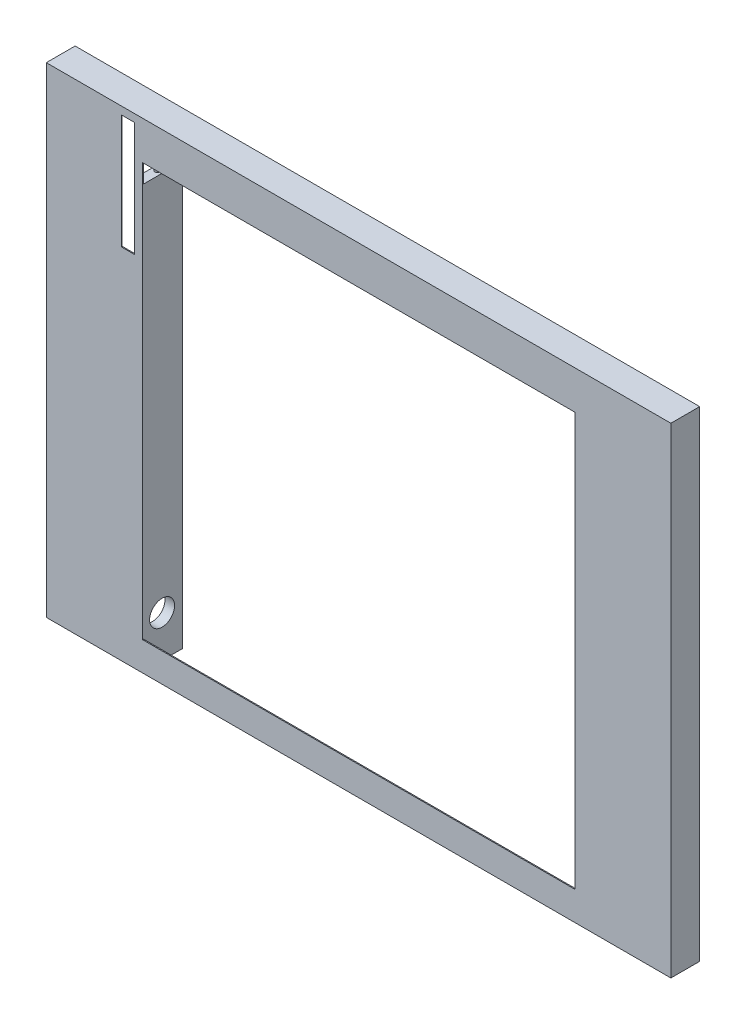
ISO-10303-21;
HEADER;
FILE_DESCRIPTION(('STEP AP214'),'2;1');
FILE_NAME('part.step','',(''),(''),'','','');
FILE_SCHEMA(('AUTOMOTIVE_DESIGN { 1 0 10303 214 1 1 1 1 }'));
ENDSEC;
DATA;
#1=APPLICATION_CONTEXT('core data for automotive mechanical design processes');
#2=APPLICATION_PROTOCOL_DEFINITION('international standard','automotive_design',2000,#1);
#3=PRODUCT_CONTEXT('',#1,'mechanical');
#4=PRODUCT('Part','Part','',(#3));
#5=PRODUCT_RELATED_PRODUCT_CATEGORY('part','',(#4));
#6=PRODUCT_DEFINITION_FORMATION('','',#4);
#7=PRODUCT_DEFINITION_CONTEXT('part definition',#1,'design');
#8=PRODUCT_DEFINITION('design','',#6,#7);
#9=PRODUCT_DEFINITION_SHAPE('','',#8);
#10=(LENGTH_UNIT() NAMED_UNIT(*) SI_UNIT(.MILLI.,.METRE.));
#11=(NAMED_UNIT(*) PLANE_ANGLE_UNIT() SI_UNIT($,.RADIAN.));
#12=(NAMED_UNIT(*) SI_UNIT($,.STERADIAN.) SOLID_ANGLE_UNIT());
#13=UNCERTAINTY_MEASURE_WITH_UNIT(LENGTH_MEASURE(1.E-05),#10,'distance_accuracy_value','');
#14=(GEOMETRIC_REPRESENTATION_CONTEXT(3) GLOBAL_UNCERTAINTY_ASSIGNED_CONTEXT((#13)) GLOBAL_UNIT_ASSIGNED_CONTEXT((#10,
#11,#12)) REPRESENTATION_CONTEXT('',''));
#15=CARTESIAN_POINT('',(0.,0.,0.));
#16=DIRECTION('',(0.,0.,1.));
#17=DIRECTION('',(1.,0.,0.));
#18=AXIS2_PLACEMENT_3D('',#15,#16,#17);
#19=CARTESIAN_POINT('',(0.,0.,14.));
#20=DIRECTION('',(0.,0.,1.));
#21=DIRECTION('',(1.,0.,0.));
#22=AXIS2_PLACEMENT_3D('',#19,#20,#21);
#23=PLANE('',#22);
#24=DIRECTION('',(1.,0.,0.));
#25=VECTOR('',#24,1.);
#26=CARTESIAN_POINT('',(0.,-220.,14.));
#27=LINE('',#26,#25);
#28=CARTESIAN_POINT('',(-225.,-220.,14.));
#29=VERTEX_POINT('',#28);
#30=CARTESIAN_POINT('',(225.,-220.,14.));
#31=VERTEX_POINT('',#30);
#32=EDGE_CURVE('E445',#29,#31,#27,.T.);
#33=ORIENTED_EDGE('',*,*,#32,.T.);
#34=DIRECTION('',(0.,-1.,0.));
#35=VECTOR('',#34,1.);
#36=CARTESIAN_POINT('',(225.,190.,14.));
#37=LINE('',#36,#35);
#38=CARTESIAN_POINT('',(225.,-249.,14.));
#39=VERTEX_POINT('',#38);
#40=EDGE_CURVE('E289',#31,#39,#37,.T.);
#41=ORIENTED_EDGE('',*,*,#40,.T.);
#42=DIRECTION('',(1.,0.,0.));
#43=VECTOR('',#42,1.);
#44=CARTESIAN_POINT('',(325.,-249.,14.));
#45=LINE('',#44,#43);
#46=CARTESIAN_POINT('',(-225.,-249.,14.));
#47=VERTEX_POINT('',#46);
#48=EDGE_CURVE('E369',#47,#39,#45,.T.);
#49=ORIENTED_EDGE('',*,*,#48,.F.);
#50=DIRECTION('',(0.,-1.,0.));
#51=VECTOR('',#50,1.);
#52=CARTESIAN_POINT('',(-225.,190.,14.));
#53=LINE('',#52,#51);
#54=EDGE_CURVE('E327',#29,#47,#53,.T.);
#55=ORIENTED_EDGE('',*,*,#54,.F.);
#56=EDGE_LOOP('',(#33,#41,#49,#55));
#57=FACE_BOUND('',#56,.T.);
#58=ADVANCED_FACE('F34',(#57),#23,.F.);
#59=CARTESIAN_POINT('',(325.,-249.,15.));
#60=DIRECTION('',(0.,1.,0.));
#61=DIRECTION('',(-1.,0.,0.));
#62=AXIS2_PLACEMENT_3D('',#59,#60,#61);
#63=PLANE('',#62);
#64=DIRECTION('',(0.,0.,1.));
#65=VECTOR('',#64,1.);
#66=CARTESIAN_POINT('',(225.,-249.,-27.));
#67=LINE('',#66,#65);
#68=CARTESIAN_POINT('',(225.,-249.,-15.));
#69=VERTEX_POINT('',#68);
#70=EDGE_CURVE('E318',#69,#39,#67,.T.);
#71=ORIENTED_EDGE('',*,*,#70,.F.);
#72=DIRECTION('',(1.,0.,0.));
#73=VECTOR('',#72,1.);
#74=CARTESIAN_POINT('',(325.,-249.,-15.));
#75=LINE('',#74,#73);
#76=CARTESIAN_POINT('',(-225.,-249.,-15.));
#77=VERTEX_POINT('',#76);
#78=EDGE_CURVE('E490',#77,#69,#75,.T.);
#79=ORIENTED_EDGE('',*,*,#78,.F.);
#80=DIRECTION('',(0.,0.,1.));
#81=VECTOR('',#80,1.);
#82=CARTESIAN_POINT('',(-225.,-249.,15.));
#83=LINE('',#82,#81);
#84=EDGE_CURVE('E448',#77,#47,#83,.T.);
#85=ORIENTED_EDGE('',*,*,#84,.T.);
#86=ORIENTED_EDGE('',*,*,#48,.T.);
#87=EDGE_LOOP('',(#71,#79,#85,#86));
#88=FACE_BOUND('',#87,.T.);
#89=ADVANCED_FACE('F489',(#88),#63,.T.);
#90=DIRECTION('',(1.,0.,0.));
#91=VECTOR('',#90,1.);
#92=CARTESIAN_POINT('',(-225.,190.,14.));
#93=LINE('',#92,#91);
#94=CARTESIAN_POINT('',(-233.,190.,14.));
#95=VERTEX_POINT('',#94);
#96=CARTESIAN_POINT('',(-225.,190.,14.));
#97=VERTEX_POINT('',#96);
#98=EDGE_CURVE('E336',#95,#97,#93,.T.);
#99=ORIENTED_EDGE('',*,*,#98,.F.);
#100=DIRECTION('',(0.,1.,0.));
#101=VECTOR('',#100,1.);
#102=CARTESIAN_POINT('',(-233.,0.,14.));
#103=LINE('',#102,#101);
#104=CARTESIAN_POINT('',(-233.,242.,14.));
#105=VERTEX_POINT('',#104);
#106=EDGE_CURVE('E253',#95,#105,#103,.T.);
#107=ORIENTED_EDGE('',*,*,#106,.T.);
#108=DIRECTION('',(-1.,0.,0.));
#109=VECTOR('',#108,1.);
#110=CARTESIAN_POINT('',(0.,242.,14.));
#111=LINE('',#110,#109);
#112=CARTESIAN_POINT('',(-247.,242.,14.));
#113=VERTEX_POINT('',#112);
#114=EDGE_CURVE('E259',#105,#113,#111,.T.);
#115=ORIENTED_EDGE('',*,*,#114,.T.);
#116=DIRECTION('',(0.,-1.,0.));
#117=VECTOR('',#116,1.);
#118=CARTESIAN_POINT('',(-247.,0.,14.));
#119=LINE('',#118,#117);
#120=CARTESIAN_POINT('',(-247.,123.,14.));
#121=VERTEX_POINT('',#120);
#122=EDGE_CURVE('E262',#113,#121,#119,.T.);
#123=ORIENTED_EDGE('',*,*,#122,.T.);
#124=DIRECTION('',(1.,0.,0.));
#125=VECTOR('',#124,1.);
#126=CARTESIAN_POINT('',(0.,123.,14.));
#127=LINE('',#126,#125);
#128=CARTESIAN_POINT('',(-235.,123.,14.));
#129=VERTEX_POINT('',#128);
#130=EDGE_CURVE('E256',#121,#129,#127,.T.);
#131=ORIENTED_EDGE('',*,*,#130,.T.);
#132=DIRECTION('',(0.,1.,0.));
#133=VECTOR('',#132,1.);
#134=CARTESIAN_POINT('',(-235.,-249.,14.));
#135=LINE('',#134,#133);
#136=CARTESIAN_POINT('',(-235.,-249.,14.));
#137=VERTEX_POINT('',#136);
#138=EDGE_CURVE('E322',#137,#129,#135,.T.);
#139=ORIENTED_EDGE('',*,*,#138,.F.);
#140=CARTESIAN_POINT('',(-324.,-249.,14.));
#141=VERTEX_POINT('',#140);
#142=EDGE_CURVE('E365',#141,#137,#45,.T.);
#143=ORIENTED_EDGE('',*,*,#142,.F.);
#144=DIRECTION('',(0.,-1.,0.));
#145=VECTOR('',#144,1.);
#146=CARTESIAN_POINT('',(-324.,-250.,14.));
#147=LINE('',#146,#145);
#148=CARTESIAN_POINT('',(-324.,249.,14.));
#149=VERTEX_POINT('',#148);
#150=EDGE_CURVE('E360',#149,#141,#147,.T.);
#151=ORIENTED_EDGE('',*,*,#150,.F.);
#152=DIRECTION('',(-1.,0.,0.));
#153=VECTOR('',#152,1.);
#154=CARTESIAN_POINT('',(325.,249.,14.));
#155=LINE('',#154,#153);
#156=CARTESIAN_POINT('',(324.,249.,14.));
#157=VERTEX_POINT('',#156);
#158=EDGE_CURVE('E371',#157,#149,#155,.T.);
#159=ORIENTED_EDGE('',*,*,#158,.F.);
#160=DIRECTION('',(0.,1.,0.));
#161=VECTOR('',#160,1.);
#162=CARTESIAN_POINT('',(324.,-250.,14.));
#163=LINE('',#162,#161);
#164=CARTESIAN_POINT('',(324.,-249.,14.));
#165=VERTEX_POINT('',#164);
#166=EDGE_CURVE('E368',#165,#157,#163,.T.);
#167=ORIENTED_EDGE('',*,*,#166,.F.);
#168=CARTESIAN_POINT('',(235.,-249.,14.));
#169=VERTEX_POINT('',#168);
#170=EDGE_CURVE('E363',#169,#165,#45,.T.);
#171=ORIENTED_EDGE('',*,*,#170,.F.);
#172=DIRECTION('',(0.,1.,0.));
#173=VECTOR('',#172,1.);
#174=CARTESIAN_POINT('',(235.,-249.,14.));
#175=LINE('',#174,#173);
#176=CARTESIAN_POINT('',(235.,190.,14.));
#177=VERTEX_POINT('',#176);
#178=EDGE_CURVE('E294',#169,#177,#175,.T.);
#179=ORIENTED_EDGE('',*,*,#178,.T.);
#180=DIRECTION('',(-1.,0.,0.));
#181=VECTOR('',#180,1.);
#182=CARTESIAN_POINT('',(225.,190.,14.));
#183=LINE('',#182,#181);
#184=CARTESIAN_POINT('',(225.,190.,14.));
#185=VERTEX_POINT('',#184);
#186=EDGE_CURVE('E305',#177,#185,#183,.T.);
#187=ORIENTED_EDGE('',*,*,#186,.T.);
#188=DIRECTION('',(0.,1.,0.));
#189=VECTOR('',#188,1.);
#190=CARTESIAN_POINT('',(225.,-210.,14.));
#191=LINE('',#190,#189);
#192=CARTESIAN_POINT('',(225.,210.,14.));
#193=VERTEX_POINT('',#192);
#194=EDGE_CURVE('E384',#185,#193,#191,.T.);
#195=ORIENTED_EDGE('',*,*,#194,.T.);
#196=DIRECTION('',(-1.,0.,0.));
#197=VECTOR('',#196,1.);
#198=CARTESIAN_POINT('',(225.,210.,14.));
#199=LINE('',#198,#197);
#200=CARTESIAN_POINT('',(-225.,210.,14.));
#201=VERTEX_POINT('',#200);
#202=EDGE_CURVE('E386',#193,#201,#199,.T.);
#203=ORIENTED_EDGE('',*,*,#202,.T.);
#204=DIRECTION('',(0.,-1.,0.));
#205=VECTOR('',#204,1.);
#206=CARTESIAN_POINT('',(-225.,-210.,14.));
#207=LINE('',#206,#205);
#208=EDGE_CURVE('E359',#201,#97,#207,.T.);
#209=ORIENTED_EDGE('',*,*,#208,.T.);
#210=EDGE_LOOP('',(#99,#107,#115,#123,#131,#139,#143,#151,#159,#167,#171,#179,#187,#195,#203,#209));
#211=FACE_BOUND('',#210,.T.);
#212=ADVANCED_FACE('F460',(#211),#23,.F.);
#213=ORIENTED_EDGE('',*,*,#142,.T.);
#214=DIRECTION('',(0.,0.,-1.));
#215=VECTOR('',#214,1.);
#216=CARTESIAN_POINT('',(-235.,-249.,15.));
#217=LINE('',#216,#215);
#218=CARTESIAN_POINT('',(-235.,-249.,-15.));
#219=VERTEX_POINT('',#218);
#220=EDGE_CURVE('E451',#137,#219,#217,.T.);
#221=ORIENTED_EDGE('',*,*,#220,.T.);
#222=CARTESIAN_POINT('',(-324.,-249.,-15.));
#223=VERTEX_POINT('',#222);
#224=EDGE_CURVE('E399',#223,#219,#75,.T.);
#225=ORIENTED_EDGE('',*,*,#224,.F.);
#226=DIRECTION('',(0.,0.,-1.));
#227=VECTOR('',#226,1.);
#228=CARTESIAN_POINT('',(-324.,-249.,15.));
#229=LINE('',#228,#227);
#230=EDGE_CURVE('E374',#141,#223,#229,.T.);
#231=ORIENTED_EDGE('',*,*,#230,.F.);
#232=EDGE_LOOP('',(#213,#221,#225,#231));
#233=FACE_BOUND('',#232,.T.);
#234=ADVANCED_FACE('F543',(#233),#63,.T.);
#235=DIRECTION('',(0.,0.,1.));
#236=VECTOR('',#235,1.);
#237=CARTESIAN_POINT('',(235.,-249.,-27.));
#238=LINE('',#237,#236);
#239=CARTESIAN_POINT('',(235.,-249.,-15.));
#240=VERTEX_POINT('',#239);
#241=EDGE_CURVE('E303',#240,#169,#238,.T.);
#242=ORIENTED_EDGE('',*,*,#241,.T.);
#243=ORIENTED_EDGE('',*,*,#170,.T.);
#244=DIRECTION('',(0.,0.,-1.));
#245=VECTOR('',#244,1.);
#246=CARTESIAN_POINT('',(324.,-249.,15.));
#247=LINE('',#246,#245);
#248=CARTESIAN_POINT('',(324.,-249.,-15.));
#249=VERTEX_POINT('',#248);
#250=EDGE_CURVE('E378',#165,#249,#247,.T.);
#251=ORIENTED_EDGE('',*,*,#250,.T.);
#252=EDGE_CURVE('E393',#240,#249,#75,.T.);
#253=ORIENTED_EDGE('',*,*,#252,.F.);
#254=EDGE_LOOP('',(#242,#243,#251,#253));
#255=FACE_BOUND('',#254,.T.);
#256=ADVANCED_FACE('F510',(#255),#63,.T.);
#257=CARTESIAN_POINT('',(0.,0.,15.));
#258=DIRECTION('',(0.,0.,1.));
#259=DIRECTION('',(1.,0.,0.));
#260=AXIS2_PLACEMENT_3D('',#257,#258,#259);
#261=PLANE('',#260);
#262=DIRECTION('',(0.,-1.,0.));
#263=VECTOR('',#262,1.);
#264=CARTESIAN_POINT('',(-247.,242.,15.));
#265=LINE('',#264,#263);
#266=CARTESIAN_POINT('',(-247.,242.,15.));
#267=VERTEX_POINT('',#266);
#268=CARTESIAN_POINT('',(-247.,123.,15.));
#269=VERTEX_POINT('',#268);
#270=EDGE_CURVE('E49',#267,#269,#265,.T.);
#271=ORIENTED_EDGE('',*,*,#270,.F.);
#272=DIRECTION('',(-1.,0.,0.));
#273=VECTOR('',#272,1.);
#274=CARTESIAN_POINT('',(-247.,242.,15.));
#275=LINE('',#274,#273);
#276=CARTESIAN_POINT('',(-233.,242.,15.));
#277=VERTEX_POINT('',#276);
#278=EDGE_CURVE('E224',#277,#267,#275,.T.);
#279=ORIENTED_EDGE('',*,*,#278,.F.);
#280=DIRECTION('',(0.,1.,0.));
#281=VECTOR('',#280,1.);
#282=CARTESIAN_POINT('',(-233.,242.,15.));
#283=LINE('',#282,#281);
#284=CARTESIAN_POINT('',(-233.,123.,15.));
#285=VERTEX_POINT('',#284);
#286=EDGE_CURVE('E245',#285,#277,#283,.T.);
#287=ORIENTED_EDGE('',*,*,#286,.F.);
#288=DIRECTION('',(1.,0.,0.));
#289=VECTOR('',#288,1.);
#290=CARTESIAN_POINT('',(-247.,123.,15.));
#291=LINE('',#290,#289);
#292=EDGE_CURVE('E230',#269,#285,#291,.T.);
#293=ORIENTED_EDGE('',*,*,#292,.F.);
#294=EDGE_LOOP('',(#271,#279,#287,#293));
#295=FACE_BOUND('',#294,.T.);
#296=DIRECTION('',(0.,1.,0.));
#297=VECTOR('',#296,1.);
#298=CARTESIAN_POINT('',(225.,-210.,15.));
#299=LINE('',#298,#297);
#300=CARTESIAN_POINT('',(225.,-220.,15.));
#301=VERTEX_POINT('',#300);
#302=CARTESIAN_POINT('',(225.,210.,15.));
#303=VERTEX_POINT('',#302);
#304=EDGE_CURVE('E404',#301,#303,#299,.T.);
#305=ORIENTED_EDGE('',*,*,#304,.F.);
#306=DIRECTION('',(1.,0.,0.));
#307=VECTOR('',#306,1.);
#308=CARTESIAN_POINT('',(0.,-220.,15.));
#309=LINE('',#308,#307);
#310=CARTESIAN_POINT('',(-225.,-220.,15.));
#311=VERTEX_POINT('',#310);
#312=EDGE_CURVE('E354',#311,#301,#309,.T.);
#313=ORIENTED_EDGE('',*,*,#312,.F.);
#314=DIRECTION('',(0.,-1.,0.));
#315=VECTOR('',#314,1.);
#316=CARTESIAN_POINT('',(-225.,-210.,15.));
#317=LINE('',#316,#315);
#318=CARTESIAN_POINT('',(-225.,210.,15.));
#319=VERTEX_POINT('',#318);
#320=EDGE_CURVE('E377',#319,#311,#317,.T.);
#321=ORIENTED_EDGE('',*,*,#320,.F.);
#322=DIRECTION('',(-1.,0.,0.));
#323=VECTOR('',#322,1.);
#324=CARTESIAN_POINT('',(225.,210.,15.));
#325=LINE('',#324,#323);
#326=EDGE_CURVE('E407',#303,#319,#325,.T.);
#327=ORIENTED_EDGE('',*,*,#326,.F.);
#328=EDGE_LOOP('',(#305,#313,#321,#327));
#329=FACE_BOUND('',#328,.T.);
#330=DIRECTION('',(0.,-1.,0.));
#331=VECTOR('',#330,1.);
#332=CARTESIAN_POINT('',(-325.,-250.,15.));
#333=LINE('',#332,#331);
#334=CARTESIAN_POINT('',(-325.,250.,15.));
#335=VERTEX_POINT('',#334);
#336=CARTESIAN_POINT('',(-325.,-250.,15.));
#337=VERTEX_POINT('',#336);
#338=EDGE_CURVE('E416',#335,#337,#333,.T.);
#339=ORIENTED_EDGE('',*,*,#338,.T.);
#340=DIRECTION('',(1.,0.,0.));
#341=VECTOR('',#340,1.);
#342=CARTESIAN_POINT('',(325.,-250.,15.));
#343=LINE('',#342,#341);
#344=CARTESIAN_POINT('',(325.,-250.,15.));
#345=VERTEX_POINT('',#344);
#346=EDGE_CURVE('E419',#337,#345,#343,.T.);
#347=ORIENTED_EDGE('',*,*,#346,.T.);
#348=DIRECTION('',(0.,1.,0.));
#349=VECTOR('',#348,1.);
#350=CARTESIAN_POINT('',(325.,-250.,15.));
#351=LINE('',#350,#349);
#352=CARTESIAN_POINT('',(325.,250.,15.));
#353=VERTEX_POINT('',#352);
#354=EDGE_CURVE('E422',#345,#353,#351,.T.);
#355=ORIENTED_EDGE('',*,*,#354,.T.);
#356=DIRECTION('',(-1.,0.,0.));
#357=VECTOR('',#356,1.);
#358=CARTESIAN_POINT('',(325.,250.,15.));
#359=LINE('',#358,#357);
#360=EDGE_CURVE('E424',#353,#335,#359,.T.);
#361=ORIENTED_EDGE('',*,*,#360,.T.);
#362=EDGE_LOOP('',(#339,#347,#355,#361));
#363=FACE_BOUND('',#362,.T.);
#364=ADVANCED_FACE('F472',(#295,#329,#363),#261,.T.);
#365=CARTESIAN_POINT('',(0.,0.,-15.));
#366=DIRECTION('',(0.,0.,1.));
#367=DIRECTION('',(1.,0.,0.));
#368=AXIS2_PLACEMENT_3D('',#365,#366,#367);
#369=PLANE('',#368);
#370=DIRECTION('',(-1.,0.,0.));
#371=VECTOR('',#370,1.);
#372=CARTESIAN_POINT('',(325.,249.,-15.));
#373=LINE('',#372,#371);
#374=CARTESIAN_POINT('',(324.,249.,-15.));
#375=VERTEX_POINT('',#374);
#376=CARTESIAN_POINT('',(-324.,249.,-15.));
#377=VERTEX_POINT('',#376);
#378=EDGE_CURVE('E364',#375,#377,#373,.T.);
#379=ORIENTED_EDGE('',*,*,#378,.T.);
#380=DIRECTION('',(0.,-1.,0.));
#381=VECTOR('',#380,1.);
#382=CARTESIAN_POINT('',(-324.,-250.,-15.));
#383=LINE('',#382,#381);
#384=EDGE_CURVE('E388',#377,#223,#383,.T.);
#385=ORIENTED_EDGE('',*,*,#384,.T.);
#386=ORIENTED_EDGE('',*,*,#224,.T.);
#387=EDGE_CURVE('E402',#219,#77,#75,.T.);
#388=ORIENTED_EDGE('',*,*,#387,.T.);
#389=ORIENTED_EDGE('',*,*,#78,.T.);
#390=EDGE_CURVE('E497',#69,#240,#75,.T.);
#391=ORIENTED_EDGE('',*,*,#390,.T.);
#392=ORIENTED_EDGE('',*,*,#252,.T.);
#393=DIRECTION('',(0.,1.,0.));
#394=VECTOR('',#393,1.);
#395=CARTESIAN_POINT('',(324.,-250.,-15.));
#396=LINE('',#395,#394);
#397=EDGE_CURVE('E396',#249,#375,#396,.T.);
#398=ORIENTED_EDGE('',*,*,#397,.T.);
#399=EDGE_LOOP('',(#379,#385,#386,#388,#389,#391,#392,#398));
#400=FACE_BOUND('',#399,.T.);
#401=DIRECTION('',(0.,-1.,0.));
#402=VECTOR('',#401,1.);
#403=CARTESIAN_POINT('',(-325.,-250.,-15.));
#404=LINE('',#403,#402);
#405=CARTESIAN_POINT('',(-325.,250.,-15.));
#406=VERTEX_POINT('',#405);
#407=CARTESIAN_POINT('',(-325.,-250.,-15.));
#408=VERTEX_POINT('',#407);
#409=EDGE_CURVE('E415',#406,#408,#404,.T.);
#410=ORIENTED_EDGE('',*,*,#409,.F.);
#411=DIRECTION('',(-1.,0.,0.));
#412=VECTOR('',#411,1.);
#413=CARTESIAN_POINT('',(325.,250.,-15.));
#414=LINE('',#413,#412);
#415=CARTESIAN_POINT('',(325.,250.,-15.));
#416=VERTEX_POINT('',#415);
#417=EDGE_CURVE('E420',#416,#406,#414,.T.);
#418=ORIENTED_EDGE('',*,*,#417,.F.);
#419=DIRECTION('',(0.,1.,0.));
#420=VECTOR('',#419,1.);
#421=CARTESIAN_POINT('',(325.,-250.,-15.));
#422=LINE('',#421,#420);
#423=CARTESIAN_POINT('',(325.,-250.,-15.));
#424=VERTEX_POINT('',#423);
#425=EDGE_CURVE('E431',#424,#416,#422,.T.);
#426=ORIENTED_EDGE('',*,*,#425,.F.);
#427=DIRECTION('',(1.,0.,0.));
#428=VECTOR('',#427,1.);
#429=CARTESIAN_POINT('',(325.,-250.,-15.));
#430=LINE('',#429,#428);
#431=EDGE_CURVE('E429',#408,#424,#430,.T.);
#432=ORIENTED_EDGE('',*,*,#431,.F.);
#433=EDGE_LOOP('',(#410,#418,#426,#432));
#434=FACE_BOUND('',#433,.T.);
#435=ADVANCED_FACE('F495',(#400,#434),#369,.F.);
#436=CARTESIAN_POINT('',(-325.,-250.,15.));
#437=DIRECTION('',(1.,0.,0.));
#438=DIRECTION('',(0.,0.,-1.));
#439=AXIS2_PLACEMENT_3D('',#436,#437,#438);
#440=PLANE('',#439);
#441=ORIENTED_EDGE('',*,*,#409,.T.);
#442=DIRECTION('',(0.,0.,-1.));
#443=VECTOR('',#442,1.);
#444=CARTESIAN_POINT('',(-325.,-250.,15.));
#445=LINE('',#444,#443);
#446=EDGE_CURVE('E442',#337,#408,#445,.T.);
#447=ORIENTED_EDGE('',*,*,#446,.F.);
#448=ORIENTED_EDGE('',*,*,#338,.F.);
#449=DIRECTION('',(0.,0.,-1.));
#450=VECTOR('',#449,1.);
#451=CARTESIAN_POINT('',(-325.,250.,15.));
#452=LINE('',#451,#450);
#453=EDGE_CURVE('E426',#335,#406,#452,.T.);
#454=ORIENTED_EDGE('',*,*,#453,.T.);
#455=EDGE_LOOP('',(#441,#447,#448,#454));
#456=FACE_BOUND('',#455,.T.);
#457=ADVANCED_FACE('F36',(#456),#440,.F.);
#458=CARTESIAN_POINT('',(325.,-250.,15.));
#459=DIRECTION('',(0.,1.,0.));
#460=DIRECTION('',(-1.,0.,0.));
#461=AXIS2_PLACEMENT_3D('',#458,#459,#460);
#462=PLANE('',#461);
#463=ORIENTED_EDGE('',*,*,#431,.T.);
#464=DIRECTION('',(0.,0.,-1.));
#465=VECTOR('',#464,1.);
#466=CARTESIAN_POINT('',(325.,-250.,15.));
#467=LINE('',#466,#465);
#468=EDGE_CURVE('E439',#345,#424,#467,.T.);
#469=ORIENTED_EDGE('',*,*,#468,.F.);
#470=ORIENTED_EDGE('',*,*,#346,.F.);
#471=ORIENTED_EDGE('',*,*,#446,.T.);
#472=EDGE_LOOP('',(#463,#469,#470,#471));
#473=FACE_BOUND('',#472,.T.);
#474=ADVANCED_FACE('F584',(#473),#462,.F.);
#475=CARTESIAN_POINT('',(325.,-250.,15.));
#476=DIRECTION('',(-1.,0.,0.));
#477=DIRECTION('',(0.,0.,1.));
#478=AXIS2_PLACEMENT_3D('',#475,#476,#477);
#479=PLANE('',#478);
#480=ORIENTED_EDGE('',*,*,#425,.T.);
#481=DIRECTION('',(0.,0.,-1.));
#482=VECTOR('',#481,1.);
#483=CARTESIAN_POINT('',(325.,250.,15.));
#484=LINE('',#483,#482);
#485=EDGE_CURVE('E436',#353,#416,#484,.T.);
#486=ORIENTED_EDGE('',*,*,#485,.F.);
#487=ORIENTED_EDGE('',*,*,#354,.F.);
#488=ORIENTED_EDGE('',*,*,#468,.T.);
#489=EDGE_LOOP('',(#480,#486,#487,#488));
#490=FACE_BOUND('',#489,.T.);
#491=ADVANCED_FACE('F581',(#490),#479,.F.);
#492=CARTESIAN_POINT('',(325.,250.,15.));
#493=DIRECTION('',(0.,-1.,0.));
#494=DIRECTION('',(1.,0.,0.));
#495=AXIS2_PLACEMENT_3D('',#492,#493,#494);
#496=PLANE('',#495);
#497=ORIENTED_EDGE('',*,*,#417,.T.);
#498=ORIENTED_EDGE('',*,*,#453,.F.);
#499=ORIENTED_EDGE('',*,*,#360,.F.);
#500=ORIENTED_EDGE('',*,*,#485,.T.);
#501=EDGE_LOOP('',(#497,#498,#499,#500));
#502=FACE_BOUND('',#501,.T.);
#503=ADVANCED_FACE('F573',(#502),#496,.F.);
#504=CARTESIAN_POINT('',(-225.,-210.,15.));
#505=DIRECTION('',(1.,0.,0.));
#506=DIRECTION('',(0.,0.,-1.));
#507=AXIS2_PLACEMENT_3D('',#504,#505,#506);
#508=PLANE('',#507);
#509=CARTESIAN_POINT('',(-225.,-206.,-5.5));
#510=DIRECTION('',(1.,0.,0.));
#511=DIRECTION('',(0.,0.,-1.));
#512=AXIS2_PLACEMENT_3D('',#509,#510,#511);
#513=CIRCLE('',#512,13.);
#514=CARTESIAN_POINT('',(-225.,-206.,-18.5));
#515=VERTEX_POINT('',#514);
#516=EDGE_CURVE('E286',#515,#515,#513,.T.);
#517=ORIENTED_EDGE('',*,*,#516,.F.);
#518=EDGE_LOOP('',(#517));
#519=FACE_BOUND('',#518,.T.);
#520=ORIENTED_EDGE('',*,*,#208,.F.);
#521=DIRECTION('',(0.,0.,-1.));
#522=VECTOR('',#521,1.);
#523=CARTESIAN_POINT('',(-225.,210.,15.));
#524=LINE('',#523,#522);
#525=EDGE_CURVE('E409',#319,#201,#524,.T.);
#526=ORIENTED_EDGE('',*,*,#525,.F.);
#527=ORIENTED_EDGE('',*,*,#320,.T.);
#528=DIRECTION('',(0.,0.,1.));
#529=VECTOR('',#528,1.);
#530=CARTESIAN_POINT('',(-225.,-220.,-20.));
#531=LINE('',#530,#529);
#532=EDGE_CURVE('E350',#29,#311,#531,.T.);
#533=ORIENTED_EDGE('',*,*,#532,.F.);
#534=ORIENTED_EDGE('',*,*,#54,.T.);
#535=ORIENTED_EDGE('',*,*,#84,.F.);
#536=DIRECTION('',(0.,0.,1.));
#537=VECTOR('',#536,1.);
#538=CARTESIAN_POINT('',(-225.,-249.,-27.));
#539=LINE('',#538,#537);
#540=CARTESIAN_POINT('',(-225.,-249.,-27.));
#541=VERTEX_POINT('',#540);
#542=EDGE_CURVE('E333',#541,#77,#539,.T.);
#543=ORIENTED_EDGE('',*,*,#542,.F.);
#544=DIRECTION('',(0.,-1.,0.));
#545=VECTOR('',#544,1.);
#546=CARTESIAN_POINT('',(-225.,190.,-27.));
#547=LINE('',#546,#545);
#548=CARTESIAN_POINT('',(-225.,190.,-27.));
#549=VERTEX_POINT('',#548);
#550=EDGE_CURVE('E331',#549,#541,#547,.T.);
#551=ORIENTED_EDGE('',*,*,#550,.F.);
#552=DIRECTION('',(0.,0.,1.));
#553=VECTOR('',#552,1.);
#554=CARTESIAN_POINT('',(-225.,190.,-27.));
#555=LINE('',#554,#553);
#556=EDGE_CURVE('E341',#549,#97,#555,.T.);
#557=ORIENTED_EDGE('',*,*,#556,.T.);
#558=EDGE_LOOP('',(#520,#526,#527,#533,#534,#535,#543,#551,#557));
#559=FACE_BOUND('',#558,.T.);
#560=ADVANCED_FACE('F465',(#519,#559),#508,.T.);
#561=CARTESIAN_POINT('',(225.,-210.,15.));
#562=DIRECTION('',(-1.,0.,0.));
#563=DIRECTION('',(0.,0.,1.));
#564=AXIS2_PLACEMENT_3D('',#561,#562,#563);
#565=PLANE('',#564);
#566=CARTESIAN_POINT('',(225.,-206.,-5.5));
#567=DIRECTION('',(-1.,0.,0.));
#568=DIRECTION('',(0.,0.,1.));
#569=AXIS2_PLACEMENT_3D('',#566,#567,#568);
#570=CIRCLE('',#569,13.);
#571=CARTESIAN_POINT('',(225.,-206.,7.50000000000001));
#572=VERTEX_POINT('',#571);
#573=EDGE_CURVE('E281',#572,#572,#570,.T.);
#574=ORIENTED_EDGE('',*,*,#573,.F.);
#575=EDGE_LOOP('',(#574));
#576=FACE_BOUND('',#575,.T.);
#577=ORIENTED_EDGE('',*,*,#194,.F.);
#578=DIRECTION('',(0.,0.,1.));
#579=VECTOR('',#578,1.);
#580=CARTESIAN_POINT('',(225.,190.,-27.));
#581=LINE('',#580,#579);
#582=CARTESIAN_POINT('',(225.,190.,-27.));
#583=VERTEX_POINT('',#582);
#584=EDGE_CURVE('E315',#583,#185,#581,.T.);
#585=ORIENTED_EDGE('',*,*,#584,.F.);
#586=DIRECTION('',(0.,-1.,0.));
#587=VECTOR('',#586,1.);
#588=CARTESIAN_POINT('',(225.,190.,-27.));
#589=LINE('',#588,#587);
#590=CARTESIAN_POINT('',(225.,-249.,-27.));
#591=VERTEX_POINT('',#590);
#592=EDGE_CURVE('E293',#583,#591,#589,.T.);
#593=ORIENTED_EDGE('',*,*,#592,.T.);
#594=EDGE_CURVE('E319',#591,#69,#67,.T.);
#595=ORIENTED_EDGE('',*,*,#594,.T.);
#596=ORIENTED_EDGE('',*,*,#70,.T.);
#597=ORIENTED_EDGE('',*,*,#40,.F.);
#598=DIRECTION('',(0.,0.,1.));
#599=VECTOR('',#598,1.);
#600=CARTESIAN_POINT('',(225.,-220.,-20.));
#601=LINE('',#600,#599);
#602=EDGE_CURVE('E351',#31,#301,#601,.T.);
#603=ORIENTED_EDGE('',*,*,#602,.T.);
#604=ORIENTED_EDGE('',*,*,#304,.T.);
#605=DIRECTION('',(0.,0.,-1.));
#606=VECTOR('',#605,1.);
#607=CARTESIAN_POINT('',(225.,210.,15.));
#608=LINE('',#607,#606);
#609=EDGE_CURVE('E412',#303,#193,#608,.T.);
#610=ORIENTED_EDGE('',*,*,#609,.T.);
#611=EDGE_LOOP('',(#577,#585,#593,#595,#596,#597,#603,#604,#610));
#612=FACE_BOUND('',#611,.T.);
#613=ADVANCED_FACE('F485',(#576,#612),#565,.T.);
#614=CARTESIAN_POINT('',(225.,210.,15.));
#615=DIRECTION('',(0.,-1.,0.));
#616=DIRECTION('',(1.,0.,0.));
#617=AXIS2_PLACEMENT_3D('',#614,#615,#616);
#618=PLANE('',#617);
#619=ORIENTED_EDGE('',*,*,#202,.F.);
#620=ORIENTED_EDGE('',*,*,#609,.F.);
#621=ORIENTED_EDGE('',*,*,#326,.T.);
#622=ORIENTED_EDGE('',*,*,#525,.T.);
#623=EDGE_LOOP('',(#619,#620,#621,#622));
#624=FACE_BOUND('',#623,.T.);
#625=ADVANCED_FACE('F469',(#624),#618,.T.);
#626=CARTESIAN_POINT('',(-324.,-250.,15.));
#627=DIRECTION('',(1.,0.,0.));
#628=DIRECTION('',(0.,0.,-1.));
#629=AXIS2_PLACEMENT_3D('',#626,#627,#628);
#630=PLANE('',#629);
#631=ORIENTED_EDGE('',*,*,#384,.F.);
#632=DIRECTION('',(0.,0.,-1.));
#633=VECTOR('',#632,1.);
#634=CARTESIAN_POINT('',(-324.,249.,15.));
#635=LINE('',#634,#633);
#636=EDGE_CURVE('E373',#149,#377,#635,.T.);
#637=ORIENTED_EDGE('',*,*,#636,.F.);
#638=ORIENTED_EDGE('',*,*,#150,.T.);
#639=ORIENTED_EDGE('',*,*,#230,.T.);
#640=EDGE_LOOP('',(#631,#637,#638,#639));
#641=FACE_BOUND('',#640,.T.);
#642=ADVANCED_FACE('F559',(#641),#630,.T.);
#643=CARTESIAN_POINT('',(324.,-250.,15.));
#644=DIRECTION('',(-1.,0.,0.));
#645=DIRECTION('',(0.,0.,1.));
#646=AXIS2_PLACEMENT_3D('',#643,#644,#645);
#647=PLANE('',#646);
#648=ORIENTED_EDGE('',*,*,#397,.F.);
#649=ORIENTED_EDGE('',*,*,#250,.F.);
#650=ORIENTED_EDGE('',*,*,#166,.T.);
#651=DIRECTION('',(0.,0.,-1.));
#652=VECTOR('',#651,1.);
#653=CARTESIAN_POINT('',(324.,249.,15.));
#654=LINE('',#653,#652);
#655=EDGE_CURVE('E380',#157,#375,#654,.T.);
#656=ORIENTED_EDGE('',*,*,#655,.T.);
#657=EDGE_LOOP('',(#648,#649,#650,#656));
#658=FACE_BOUND('',#657,.T.);
#659=ADVANCED_FACE('F506',(#658),#647,.T.);
#660=CARTESIAN_POINT('',(325.,249.,15.));
#661=DIRECTION('',(0.,-1.,0.));
#662=DIRECTION('',(1.,0.,0.));
#663=AXIS2_PLACEMENT_3D('',#660,#661,#662);
#664=PLANE('',#663);
#665=ORIENTED_EDGE('',*,*,#378,.F.);
#666=ORIENTED_EDGE('',*,*,#655,.F.);
#667=ORIENTED_EDGE('',*,*,#158,.T.);
#668=ORIENTED_EDGE('',*,*,#636,.T.);
#669=EDGE_LOOP('',(#665,#666,#667,#668));
#670=FACE_BOUND('',#669,.T.);
#671=ADVANCED_FACE('F562',(#670),#664,.T.);
#672=CARTESIAN_POINT('',(225.,-220.,-20.));
#673=DIRECTION('',(0.,-1.,0.));
#674=DIRECTION('',(1.,0.,0.));
#675=AXIS2_PLACEMENT_3D('',#672,#673,#674);
#676=PLANE('',#675);
#677=ORIENTED_EDGE('',*,*,#312,.T.);
#678=ORIENTED_EDGE('',*,*,#602,.F.);
#679=ORIENTED_EDGE('',*,*,#32,.F.);
#680=ORIENTED_EDGE('',*,*,#532,.T.);
#681=EDGE_LOOP('',(#677,#678,#679,#680));
#682=FACE_BOUND('',#681,.T.);
#683=ADVANCED_FACE('F478',(#682),#676,.F.);
#684=CARTESIAN_POINT('',(-235.,-249.,-27.));
#685=DIRECTION('',(0.,1.,0.));
#686=DIRECTION('',(0.,0.,1.));
#687=AXIS2_PLACEMENT_3D('',#684,#685,#686);
#688=PLANE('',#687);
#689=ORIENTED_EDGE('',*,*,#542,.T.);
#690=ORIENTED_EDGE('',*,*,#387,.F.);
#691=DIRECTION('',(0.,0.,1.));
#692=VECTOR('',#691,1.);
#693=CARTESIAN_POINT('',(-235.,-249.,-27.));
#694=LINE('',#693,#692);
#695=CARTESIAN_POINT('',(-235.,-249.,-27.));
#696=VERTEX_POINT('',#695);
#697=EDGE_CURVE('E347',#696,#219,#694,.T.);
#698=ORIENTED_EDGE('',*,*,#697,.F.);
#699=DIRECTION('',(-1.,0.,0.));
#700=VECTOR('',#699,1.);
#701=CARTESIAN_POINT('',(-235.,-249.,-27.));
#702=LINE('',#701,#700);
#703=EDGE_CURVE('E323',#541,#696,#702,.T.);
#704=ORIENTED_EDGE('',*,*,#703,.F.);
#705=EDGE_LOOP('',(#689,#690,#698,#704));
#706=FACE_BOUND('',#705,.T.);
#707=ADVANCED_FACE('F625',(#706),#688,.F.);
#708=CARTESIAN_POINT('',(-235.,-249.,-27.));
#709=DIRECTION('',(1.,0.,0.));
#710=DIRECTION('',(0.,0.,-1.));
#711=AXIS2_PLACEMENT_3D('',#708,#709,#710);
#712=PLANE('',#711);
#713=CARTESIAN_POINT('',(-235.,-206.,-5.5));
#714=DIRECTION('',(-1.,0.,0.));
#715=DIRECTION('',(0.,0.,1.));
#716=AXIS2_PLACEMENT_3D('',#713,#714,#715);
#717=CIRCLE('',#716,13.);
#718=CARTESIAN_POINT('',(-235.,-206.,7.50000000000001));
#719=VERTEX_POINT('',#718);
#720=EDGE_CURVE('E275',#719,#719,#717,.T.);
#721=ORIENTED_EDGE('',*,*,#720,.F.);
#722=EDGE_LOOP('',(#721));
#723=FACE_BOUND('',#722,.T.);
#724=ORIENTED_EDGE('',*,*,#138,.T.);
#725=DIRECTION('',(0.,0.,-1.));
#726=VECTOR('',#725,1.);
#727=CARTESIAN_POINT('',(-235.,123.,-27.));
#728=LINE('',#727,#726);
#729=CARTESIAN_POINT('',(-235.,123.,10.));
#730=VERTEX_POINT('',#729);
#731=EDGE_CURVE('E12',#129,#730,#728,.T.);
#732=ORIENTED_EDGE('',*,*,#731,.T.);
#733=DIRECTION('',(0.,-1.,0.));
#734=VECTOR('',#733,1.);
#735=CARTESIAN_POINT('',(-235.,-249.,10.));
#736=LINE('',#735,#734);
#737=CARTESIAN_POINT('',(-235.,190.,10.));
#738=VERTEX_POINT('',#737);
#739=EDGE_CURVE('E222',#738,#730,#736,.T.);
#740=ORIENTED_EDGE('',*,*,#739,.F.);
#741=DIRECTION('',(0.,0.,1.));
#742=VECTOR('',#741,1.);
#743=CARTESIAN_POINT('',(-235.,190.,-27.));
#744=LINE('',#743,#742);
#745=CARTESIAN_POINT('',(-235.,190.,-27.));
#746=VERTEX_POINT('',#745);
#747=EDGE_CURVE('E344',#746,#738,#744,.T.);
#748=ORIENTED_EDGE('',*,*,#747,.F.);
#749=DIRECTION('',(0.,1.,0.));
#750=VECTOR('',#749,1.);
#751=CARTESIAN_POINT('',(-235.,-249.,-27.));
#752=LINE('',#751,#750);
#753=EDGE_CURVE('E326',#696,#746,#752,.T.);
#754=ORIENTED_EDGE('',*,*,#753,.F.);
#755=ORIENTED_EDGE('',*,*,#697,.T.);
#756=ORIENTED_EDGE('',*,*,#220,.F.);
#757=EDGE_LOOP('',(#724,#732,#740,#748,#754,#755,#756));
#758=FACE_BOUND('',#757,.T.);
#759=ADVANCED_FACE('F620',(#723,#758),#712,.F.);
#760=CARTESIAN_POINT('',(-225.,190.,-27.));
#761=DIRECTION('',(0.,-1.,0.));
#762=DIRECTION('',(1.,0.,0.));
#763=AXIS2_PLACEMENT_3D('',#760,#761,#762);
#764=PLANE('',#763);
#765=CARTESIAN_POINT('',(-230.,190.,-5.5));
#766=DIRECTION('',(0.,-1.,0.));
#767=DIRECTION('',(1.,0.,0.));
#768=AXIS2_PLACEMENT_3D('',#765,#766,#767);
#769=CIRCLE('',#768,2.5);
#770=CARTESIAN_POINT('',(-227.5,190.,-5.5));
#771=VERTEX_POINT('',#770);
#772=EDGE_CURVE('E265',#771,#771,#769,.T.);
#773=ORIENTED_EDGE('',*,*,#772,.T.);
#774=EDGE_LOOP('',(#773));
#775=FACE_BOUND('',#774,.T.);
#776=DIRECTION('',(-1.,0.,0.));
#777=VECTOR('',#776,1.);
#778=CARTESIAN_POINT('',(-225.,190.,10.));
#779=LINE('',#778,#777);
#780=CARTESIAN_POINT('',(-233.,190.,10.));
#781=VERTEX_POINT('',#780);
#782=EDGE_CURVE('E454',#781,#738,#779,.T.);
#783=ORIENTED_EDGE('',*,*,#782,.F.);
#784=DIRECTION('',(0.,0.,1.));
#785=VECTOR('',#784,1.);
#786=CARTESIAN_POINT('',(-233.,190.,-27.));
#787=LINE('',#786,#785);
#788=EDGE_CURVE('E42',#781,#95,#787,.T.);
#789=ORIENTED_EDGE('',*,*,#788,.T.);
#790=ORIENTED_EDGE('',*,*,#98,.T.);
#791=ORIENTED_EDGE('',*,*,#556,.F.);
#792=DIRECTION('',(1.,0.,0.));
#793=VECTOR('',#792,1.);
#794=CARTESIAN_POINT('',(-225.,190.,-27.));
#795=LINE('',#794,#793);
#796=EDGE_CURVE('E329',#746,#549,#795,.T.);
#797=ORIENTED_EDGE('',*,*,#796,.F.);
#798=ORIENTED_EDGE('',*,*,#747,.T.);
#799=EDGE_LOOP('',(#783,#789,#790,#791,#797,#798));
#800=FACE_BOUND('',#799,.T.);
#801=ADVANCED_FACE('F457',(#775,#800),#764,.F.);
#802=CARTESIAN_POINT('',(0.,0.,-27.));
#803=DIRECTION('',(0.,0.,-1.));
#804=DIRECTION('',(-1.,0.,0.));
#805=AXIS2_PLACEMENT_3D('',#802,#803,#804);
#806=PLANE('',#805);
#807=ORIENTED_EDGE('',*,*,#703,.T.);
#808=ORIENTED_EDGE('',*,*,#753,.T.);
#809=ORIENTED_EDGE('',*,*,#796,.T.);
#810=ORIENTED_EDGE('',*,*,#550,.T.);
#811=EDGE_LOOP('',(#807,#808,#809,#810));
#812=FACE_BOUND('',#811,.T.);
#813=ADVANCED_FACE('F637',(#812),#806,.T.);
#814=CARTESIAN_POINT('',(235.,-249.,-27.));
#815=DIRECTION('',(0.,-1.,0.));
#816=DIRECTION('',(0.,0.,-1.));
#817=AXIS2_PLACEMENT_3D('',#814,#815,#816);
#818=PLANE('',#817);
#819=ORIENTED_EDGE('',*,*,#390,.F.);
#820=ORIENTED_EDGE('',*,*,#594,.F.);
#821=DIRECTION('',(1.,0.,0.));
#822=VECTOR('',#821,1.);
#823=CARTESIAN_POINT('',(235.,-249.,-27.));
#824=LINE('',#823,#822);
#825=CARTESIAN_POINT('',(235.,-249.,-27.));
#826=VERTEX_POINT('',#825);
#827=EDGE_CURVE('E290',#591,#826,#824,.T.);
#828=ORIENTED_EDGE('',*,*,#827,.T.);
#829=EDGE_CURVE('E309',#826,#240,#238,.T.);
#830=ORIENTED_EDGE('',*,*,#829,.T.);
#831=EDGE_LOOP('',(#819,#820,#828,#830));
#832=FACE_BOUND('',#831,.T.);
#833=ADVANCED_FACE('F500',(#832),#818,.T.);
#834=CARTESIAN_POINT('',(225.,190.,-27.));
#835=DIRECTION('',(0.,1.,0.));
#836=DIRECTION('',(-1.,0.,0.));
#837=AXIS2_PLACEMENT_3D('',#834,#835,#836);
#838=PLANE('',#837);
#839=CARTESIAN_POINT('',(230.,190.,-5.5));
#840=DIRECTION('',(0.,1.,0.));
#841=DIRECTION('',(-1.,0.,0.));
#842=AXIS2_PLACEMENT_3D('',#839,#840,#841);
#843=CIRCLE('',#842,2.5);
#844=CARTESIAN_POINT('',(227.5,190.,-5.5));
#845=VERTEX_POINT('',#844);
#846=EDGE_CURVE('E269',#845,#845,#843,.T.);
#847=ORIENTED_EDGE('',*,*,#846,.F.);
#848=EDGE_LOOP('',(#847));
#849=FACE_BOUND('',#848,.T.);
#850=ORIENTED_EDGE('',*,*,#186,.F.);
#851=DIRECTION('',(0.,0.,1.));
#852=VECTOR('',#851,1.);
#853=CARTESIAN_POINT('',(235.,190.,-27.));
#854=LINE('',#853,#852);
#855=CARTESIAN_POINT('',(235.,190.,-27.));
#856=VERTEX_POINT('',#855);
#857=EDGE_CURVE('E312',#856,#177,#854,.T.);
#858=ORIENTED_EDGE('',*,*,#857,.F.);
#859=DIRECTION('',(-1.,0.,0.));
#860=VECTOR('',#859,1.);
#861=CARTESIAN_POINT('',(225.,190.,-27.));
#862=LINE('',#861,#860);
#863=EDGE_CURVE('E297',#856,#583,#862,.T.);
#864=ORIENTED_EDGE('',*,*,#863,.T.);
#865=ORIENTED_EDGE('',*,*,#584,.T.);
#866=EDGE_LOOP('',(#850,#858,#864,#865));
#867=FACE_BOUND('',#866,.T.);
#868=ADVANCED_FACE('F520',(#849,#867),#838,.T.);
#869=CARTESIAN_POINT('',(235.,-249.,-27.));
#870=DIRECTION('',(1.,0.,0.));
#871=DIRECTION('',(0.,0.,-1.));
#872=AXIS2_PLACEMENT_3D('',#869,#870,#871);
#873=PLANE('',#872);
#874=CARTESIAN_POINT('',(235.,-206.,-5.5));
#875=DIRECTION('',(-1.,0.,0.));
#876=DIRECTION('',(0.,0.,1.));
#877=AXIS2_PLACEMENT_3D('',#874,#875,#876);
#878=CIRCLE('',#877,13.);
#879=CARTESIAN_POINT('',(235.,-206.,7.50000000000001));
#880=VERTEX_POINT('',#879);
#881=EDGE_CURVE('E278',#880,#880,#878,.T.);
#882=ORIENTED_EDGE('',*,*,#881,.T.);
#883=EDGE_LOOP('',(#882));
#884=FACE_BOUND('',#883,.T.);
#885=ORIENTED_EDGE('',*,*,#178,.F.);
#886=ORIENTED_EDGE('',*,*,#241,.F.);
#887=ORIENTED_EDGE('',*,*,#829,.F.);
#888=DIRECTION('',(0.,1.,0.));
#889=VECTOR('',#888,1.);
#890=CARTESIAN_POINT('',(235.,-249.,-27.));
#891=LINE('',#890,#889);
#892=EDGE_CURVE('E300',#826,#856,#891,.T.);
#893=ORIENTED_EDGE('',*,*,#892,.T.);
#894=ORIENTED_EDGE('',*,*,#857,.T.);
#895=EDGE_LOOP('',(#885,#886,#887,#893,#894));
#896=FACE_BOUND('',#895,.T.);
#897=ADVANCED_FACE('F515',(#884,#896),#873,.T.);
#898=CARTESIAN_POINT('',(0.,0.,-27.));
#899=DIRECTION('',(0.,0.,-1.));
#900=DIRECTION('',(1.,0.,0.));
#901=AXIS2_PLACEMENT_3D('',#898,#899,#900);
#902=PLANE('',#901);
#903=ORIENTED_EDGE('',*,*,#827,.F.);
#904=ORIENTED_EDGE('',*,*,#592,.F.);
#905=ORIENTED_EDGE('',*,*,#863,.F.);
#906=ORIENTED_EDGE('',*,*,#892,.F.);
#907=EDGE_LOOP('',(#903,#904,#905,#906));
#908=FACE_BOUND('',#907,.T.);
#909=ADVANCED_FACE('F523',(#908),#902,.T.);
#910=CARTESIAN_POINT('',(235.,-206.,-5.5));
#911=DIRECTION('',(-1.,0.,0.));
#912=DIRECTION('',(0.,0.,1.));
#913=AXIS2_PLACEMENT_3D('',#910,#911,#912);
#914=CYLINDRICAL_SURFACE('',#913,13.);
#915=ORIENTED_EDGE('',*,*,#573,.T.);
#916=EDGE_LOOP('',(#915));
#917=FACE_BOUND('',#916,.T.);
#918=ORIENTED_EDGE('',*,*,#881,.F.);
#919=EDGE_LOOP('',(#918));
#920=FACE_BOUND('',#919,.T.);
#921=ADVANCED_FACE('F525',(#917,#920),#914,.F.);
#922=ORIENTED_EDGE('',*,*,#516,.T.);
#923=EDGE_LOOP('',(#922));
#924=FACE_BOUND('',#923,.T.);
#925=ORIENTED_EDGE('',*,*,#720,.T.);
#926=EDGE_LOOP('',(#925));
#927=FACE_BOUND('',#926,.T.);
#928=ADVANCED_FACE('F531',(#924,#927),#914,.F.);
#929=CARTESIAN_POINT('',(230.,240.,-5.5));
#930=DIRECTION('',(0.,-1.,0.));
#931=DIRECTION('',(1.,0.,0.));
#932=AXIS2_PLACEMENT_3D('',#929,#930,#931);
#933=CYLINDRICAL_SURFACE('',#932,2.5);
#934=CARTESIAN_POINT('',(230.,240.,-5.5));
#935=DIRECTION('',(0.,1.,0.));
#936=DIRECTION('',(-1.,0.,0.));
#937=AXIS2_PLACEMENT_3D('',#934,#935,#936);
#938=CIRCLE('',#937,2.5);
#939=CARTESIAN_POINT('',(227.5,240.,-5.5));
#940=VERTEX_POINT('',#939);
#941=EDGE_CURVE('E272',#940,#940,#938,.T.);
#942=ORIENTED_EDGE('',*,*,#941,.F.);
#943=EDGE_LOOP('',(#942));
#944=FACE_BOUND('',#943,.T.);
#945=ORIENTED_EDGE('',*,*,#846,.T.);
#946=EDGE_LOOP('',(#945));
#947=FACE_BOUND('',#946,.T.);
#948=ADVANCED_FACE('F700',(#944,#947),#933,.T.);
#949=CARTESIAN_POINT('',(230.,240.,-5.5));
#950=DIRECTION('',(0.,1.,0.));
#951=DIRECTION('',(-1.,0.,0.));
#952=AXIS2_PLACEMENT_3D('',#949,#950,#951);
#953=PLANE('',#952);
#954=ORIENTED_EDGE('',*,*,#941,.T.);
#955=EDGE_LOOP('',(#954));
#956=FACE_BOUND('',#955,.T.);
#957=ADVANCED_FACE('F696',(#956),#953,.T.);
#958=CARTESIAN_POINT('',(-230.,240.,-5.5));
#959=DIRECTION('',(0.,-1.,0.));
#960=DIRECTION('',(1.,0.,0.));
#961=AXIS2_PLACEMENT_3D('',#958,#959,#960);
#962=CYLINDRICAL_SURFACE('',#961,2.5);
#963=CARTESIAN_POINT('',(-230.,240.,-5.5));
#964=DIRECTION('',(0.,-1.,0.));
#965=DIRECTION('',(1.,0.,0.));
#966=AXIS2_PLACEMENT_3D('',#963,#964,#965);
#967=CIRCLE('',#966,2.5);
#968=CARTESIAN_POINT('',(-227.5,240.,-5.5));
#969=VERTEX_POINT('',#968);
#970=EDGE_CURVE('E266',#969,#969,#967,.T.);
#971=ORIENTED_EDGE('',*,*,#970,.T.);
#972=EDGE_LOOP('',(#971));
#973=FACE_BOUND('',#972,.T.);
#974=ORIENTED_EDGE('',*,*,#772,.F.);
#975=EDGE_LOOP('',(#974));
#976=FACE_BOUND('',#975,.T.);
#977=ADVANCED_FACE('F692',(#973,#976),#962,.T.);
#978=CARTESIAN_POINT('',(-230.,240.,-5.5));
#979=DIRECTION('',(0.,1.,0.));
#980=DIRECTION('',(1.,0.,0.));
#981=AXIS2_PLACEMENT_3D('',#978,#979,#980);
#982=PLANE('',#981);
#983=ORIENTED_EDGE('',*,*,#970,.F.);
#984=EDGE_LOOP('',(#983));
#985=FACE_BOUND('',#984,.T.);
#986=ADVANCED_FACE('F651',(#985),#982,.T.);
#987=CARTESIAN_POINT('',(-247.,242.,10.));
#988=DIRECTION('',(-1.,0.,0.));
#989=DIRECTION('',(0.,-1.,0.));
#990=AXIS2_PLACEMENT_3D('',#987,#988,#989);
#991=PLANE('',#990);
#992=DIRECTION('',(0.,0.,1.));
#993=VECTOR('',#992,1.);
#994=CARTESIAN_POINT('',(-247.,242.,10.));
#995=LINE('',#994,#993);
#996=EDGE_CURVE('E249',#113,#267,#995,.T.);
#997=ORIENTED_EDGE('',*,*,#996,.T.);
#998=ORIENTED_EDGE('',*,*,#270,.T.);
#999=DIRECTION('',(0.,0.,1.));
#1000=VECTOR('',#999,1.);
#1001=CARTESIAN_POINT('',(-247.,123.,10.));
#1002=LINE('',#1001,#1000);
#1003=EDGE_CURVE('E235',#121,#269,#1002,.T.);
#1004=ORIENTED_EDGE('',*,*,#1003,.F.);
#1005=ORIENTED_EDGE('',*,*,#122,.F.);
#1006=EDGE_LOOP('',(#997,#998,#1004,#1005));
#1007=FACE_BOUND('',#1006,.T.);
#1008=ADVANCED_FACE('F645',(#1007),#991,.F.);
#1009=CARTESIAN_POINT('',(-247.,242.,10.));
#1010=DIRECTION('',(0.,1.,0.));
#1011=DIRECTION('',(0.,0.,1.));
#1012=AXIS2_PLACEMENT_3D('',#1009,#1010,#1011);
#1013=PLANE('',#1012);
#1014=DIRECTION('',(0.,0.,1.));
#1015=VECTOR('',#1014,1.);
#1016=CARTESIAN_POINT('',(-233.,242.,10.));
#1017=LINE('',#1016,#1015);
#1018=EDGE_CURVE('E234',#105,#277,#1017,.T.);
#1019=ORIENTED_EDGE('',*,*,#1018,.T.);
#1020=ORIENTED_EDGE('',*,*,#278,.T.);
#1021=ORIENTED_EDGE('',*,*,#996,.F.);
#1022=ORIENTED_EDGE('',*,*,#114,.F.);
#1023=EDGE_LOOP('',(#1019,#1020,#1021,#1022));
#1024=FACE_BOUND('',#1023,.T.);
#1025=ADVANCED_FACE('F650',(#1024),#1013,.F.);
#1026=CARTESIAN_POINT('',(-247.,123.,10.));
#1027=DIRECTION('',(0.,-1.,0.));
#1028=DIRECTION('',(0.,0.,-1.));
#1029=AXIS2_PLACEMENT_3D('',#1026,#1027,#1028);
#1030=PLANE('',#1029);
#1031=ORIENTED_EDGE('',*,*,#1003,.T.);
#1032=ORIENTED_EDGE('',*,*,#292,.T.);
#1033=DIRECTION('',(0.,0.,1.));
#1034=VECTOR('',#1033,1.);
#1035=CARTESIAN_POINT('',(-233.,123.,10.));
#1036=LINE('',#1035,#1034);
#1037=CARTESIAN_POINT('',(-233.,123.,10.));
#1038=VERTEX_POINT('',#1037);
#1039=EDGE_CURVE('E227',#1038,#285,#1036,.T.);
#1040=ORIENTED_EDGE('',*,*,#1039,.F.);
#1041=DIRECTION('',(1.,0.,0.));
#1042=VECTOR('',#1041,1.);
#1043=CARTESIAN_POINT('',(-247.,123.,10.));
#1044=LINE('',#1043,#1042);
#1045=EDGE_CURVE('E218',#730,#1038,#1044,.T.);
#1046=ORIENTED_EDGE('',*,*,#1045,.F.);
#1047=ORIENTED_EDGE('',*,*,#731,.F.);
#1048=ORIENTED_EDGE('',*,*,#130,.F.);
#1049=EDGE_LOOP('',(#1031,#1032,#1040,#1046,#1047,#1048));
#1050=FACE_BOUND('',#1049,.T.);
#1051=ADVANCED_FACE('F228',(#1050),#1030,.F.);
#1052=CARTESIAN_POINT('',(-233.,242.,10.));
#1053=DIRECTION('',(1.,0.,0.));
#1054=DIRECTION('',(0.,1.,0.));
#1055=AXIS2_PLACEMENT_3D('',#1052,#1053,#1054);
#1056=PLANE('',#1055);
#1057=ORIENTED_EDGE('',*,*,#788,.F.);
#1058=DIRECTION('',(0.,1.,0.));
#1059=VECTOR('',#1058,1.);
#1060=CARTESIAN_POINT('',(-233.,242.,10.));
#1061=LINE('',#1060,#1059);
#1062=EDGE_CURVE('E57',#1038,#781,#1061,.T.);
#1063=ORIENTED_EDGE('',*,*,#1062,.F.);
#1064=ORIENTED_EDGE('',*,*,#1039,.T.);
#1065=ORIENTED_EDGE('',*,*,#286,.T.);
#1066=ORIENTED_EDGE('',*,*,#1018,.F.);
#1067=ORIENTED_EDGE('',*,*,#106,.F.);
#1068=EDGE_LOOP('',(#1057,#1063,#1064,#1065,#1066,#1067));
#1069=FACE_BOUND('',#1068,.T.);
#1070=ADVANCED_FACE('F237',(#1069),#1056,.F.);
#1071=CARTESIAN_POINT('',(0.,0.,10.));
#1072=DIRECTION('',(0.,0.,1.));
#1073=DIRECTION('',(1.,0.,0.));
#1074=AXIS2_PLACEMENT_3D('',#1071,#1072,#1073);
#1075=PLANE('',#1074);
#1076=ORIENTED_EDGE('',*,*,#739,.T.);
#1077=ORIENTED_EDGE('',*,*,#1045,.T.);
#1078=ORIENTED_EDGE('',*,*,#1062,.T.);
#1079=ORIENTED_EDGE('',*,*,#782,.T.);
#1080=EDGE_LOOP('',(#1076,#1077,#1078,#1079));
#1081=FACE_BOUND('',#1080,.T.);
#1082=ADVANCED_FACE('F220',(#1081),#1075,.T.);
#1083=CLOSED_SHELL('',(#58,#89,#212,#234,#256,#364,#435,#457,#474,#491,#503,#560,#613,#625,#642,
#659,#671,#683,#707,#759,#801,#813,#833,#868,#897,#909,#921,#928,#948,#957,#977,#986,#1008,
#1025,#1051,#1070,#1082));
#1084=MANIFOLD_SOLID_BREP('B2',#1083);
#1085=ADVANCED_BREP_SHAPE_REPRESENTATION('',(#18,#1084),#14);
#1086=SHAPE_DEFINITION_REPRESENTATION(#9,#1085);
ENDSEC;
END-ISO-10303-21;
